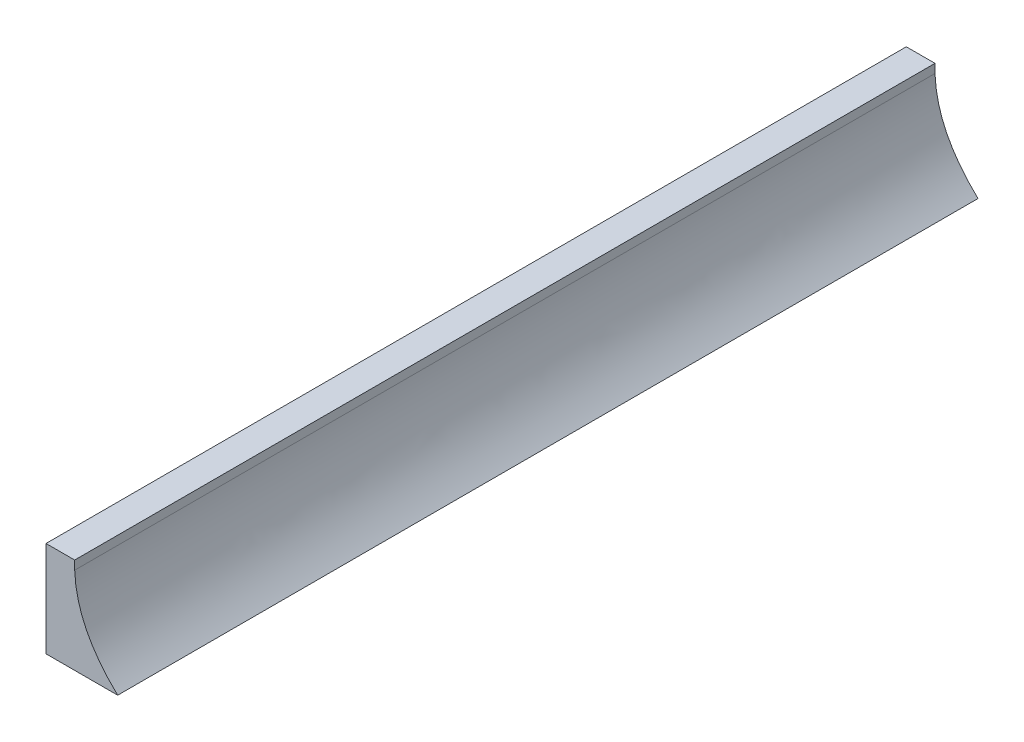
ISO-10303-21;
HEADER;
FILE_DESCRIPTION(('STEP AP214'),'2;1');
FILE_NAME('part.step','',(''),(''),'','','');
FILE_SCHEMA(('AUTOMOTIVE_DESIGN { 1 0 10303 214 1 1 1 1 }'));
ENDSEC;
DATA;
#1=APPLICATION_CONTEXT('core data for automotive mechanical design processes');
#2=APPLICATION_PROTOCOL_DEFINITION('international standard','automotive_design',2000,#1);
#3=PRODUCT_CONTEXT('',#1,'mechanical');
#4=PRODUCT('Part','Part','',(#3));
#5=PRODUCT_RELATED_PRODUCT_CATEGORY('part','',(#4));
#6=PRODUCT_DEFINITION_FORMATION('','',#4);
#7=PRODUCT_DEFINITION_CONTEXT('part definition',#1,'design');
#8=PRODUCT_DEFINITION('design','',#6,#7);
#9=PRODUCT_DEFINITION_SHAPE('','',#8);
#10=(LENGTH_UNIT() NAMED_UNIT(*) SI_UNIT(.MILLI.,.METRE.));
#11=(NAMED_UNIT(*) PLANE_ANGLE_UNIT() SI_UNIT($,.RADIAN.));
#12=(NAMED_UNIT(*) SI_UNIT($,.STERADIAN.) SOLID_ANGLE_UNIT());
#13=UNCERTAINTY_MEASURE_WITH_UNIT(LENGTH_MEASURE(1.E-05),#10,'distance_accuracy_value','');
#14=(GEOMETRIC_REPRESENTATION_CONTEXT(3) GLOBAL_UNCERTAINTY_ASSIGNED_CONTEXT((#13)) GLOBAL_UNIT_ASSIGNED_CONTEXT((#10,
#11,#12)) REPRESENTATION_CONTEXT('',''));
#15=CARTESIAN_POINT('',(0.,0.,0.));
#16=DIRECTION('',(0.,0.,1.));
#17=DIRECTION('',(1.,0.,0.));
#18=AXIS2_PLACEMENT_3D('',#15,#16,#17);
#19=CARTESIAN_POINT('',(0.,0.,180.));
#20=DIRECTION('',(0.,1.,0.));
#21=DIRECTION('',(0.,0.,1.));
#22=AXIS2_PLACEMENT_3D('',#19,#20,#21);
#23=PLANE('',#22);
#24=DIRECTION('',(0.,0.,1.));
#25=VECTOR('',#24,1.);
#26=CARTESIAN_POINT('',(0.,0.,110.));
#27=LINE('',#26,#25);
#28=CARTESIAN_POINT('',(0.,0.,110.));
#29=VERTEX_POINT('',#28);
#30=CARTESIAN_POINT('',(0.,0.,140.));
#31=VERTEX_POINT('',#30);
#32=EDGE_CURVE('E143',#29,#31,#27,.T.);
#33=ORIENTED_EDGE('',*,*,#32,.F.);
#34=DIRECTION('',(-1.,0.,0.));
#35=VECTOR('',#34,1.);
#36=CARTESIAN_POINT('',(0.,0.,110.));
#37=LINE('',#36,#35);
#38=CARTESIAN_POINT('',(-6.,0.,110.));
#39=VERTEX_POINT('',#38);
#40=EDGE_CURVE('E129',#29,#39,#37,.T.);
#41=ORIENTED_EDGE('',*,*,#40,.T.);
#42=DIRECTION('',(0.,0.,-1.));
#43=VECTOR('',#42,1.);
#44=CARTESIAN_POINT('',(-6.,0.,180.));
#45=LINE('',#44,#43);
#46=CARTESIAN_POINT('',(-6.,0.,70.));
#47=VERTEX_POINT('',#46);
#48=EDGE_CURVE('E55',#39,#47,#45,.T.);
#49=ORIENTED_EDGE('',*,*,#48,.T.);
#50=DIRECTION('',(-1.,0.,0.));
#51=VECTOR('',#50,1.);
#52=CARTESIAN_POINT('',(0.,0.,70.));
#53=LINE('',#52,#51);
#54=CARTESIAN_POINT('',(0.,0.,70.));
#55=VERTEX_POINT('',#54);
#56=EDGE_CURVE('E189',#55,#47,#53,.T.);
#57=ORIENTED_EDGE('',*,*,#56,.F.);
#58=DIRECTION('',(0.,0.,1.));
#59=VECTOR('',#58,1.);
#60=CARTESIAN_POINT('',(0.,0.,40.));
#61=LINE('',#60,#59);
#62=CARTESIAN_POINT('',(0.,0.,40.));
#63=VERTEX_POINT('',#62);
#64=EDGE_CURVE('E167',#63,#55,#61,.T.);
#65=ORIENTED_EDGE('',*,*,#64,.F.);
#66=DIRECTION('',(-1.,0.,0.));
#67=VECTOR('',#66,1.);
#68=CARTESIAN_POINT('',(0.,0.,40.));
#69=LINE('',#68,#67);
#70=CARTESIAN_POINT('',(-6.,0.,40.));
#71=VERTEX_POINT('',#70);
#72=EDGE_CURVE('E177',#63,#71,#69,.T.);
#73=ORIENTED_EDGE('',*,*,#72,.T.);
#74=CARTESIAN_POINT('',(-6.,0.,0.));
#75=VERTEX_POINT('',#74);
#76=EDGE_CURVE('E354',#71,#75,#45,.T.);
#77=ORIENTED_EDGE('',*,*,#76,.T.);
#78=DIRECTION('',(1.,0.,0.));
#79=VECTOR('',#78,1.);
#80=CARTESIAN_POINT('',(0.,0.,0.));
#81=LINE('',#80,#79);
#82=CARTESIAN_POINT('',(9.,0.,0.));
#83=VERTEX_POINT('',#82);
#84=EDGE_CURVE('E186',#75,#83,#81,.T.);
#85=ORIENTED_EDGE('',*,*,#84,.T.);
#86=DIRECTION('',(0.,0.,-1.));
#87=VECTOR('',#86,1.);
#88=CARTESIAN_POINT('',(9.,0.,180.));
#89=LINE('',#88,#87);
#90=CARTESIAN_POINT('',(9.,0.,180.));
#91=VERTEX_POINT('',#90);
#92=EDGE_CURVE('E11',#91,#83,#89,.T.);
#93=ORIENTED_EDGE('',*,*,#92,.F.);
#94=DIRECTION('',(1.,0.,0.));
#95=VECTOR('',#94,1.);
#96=CARTESIAN_POINT('',(0.,0.,180.));
#97=LINE('',#96,#95);
#98=CARTESIAN_POINT('',(-6.,0.,180.));
#99=VERTEX_POINT('',#98);
#100=EDGE_CURVE('E193',#99,#91,#97,.T.);
#101=ORIENTED_EDGE('',*,*,#100,.F.);
#102=CARTESIAN_POINT('',(-6.,0.,140.));
#103=VERTEX_POINT('',#102);
#104=EDGE_CURVE('E353',#99,#103,#45,.T.);
#105=ORIENTED_EDGE('',*,*,#104,.T.);
#106=DIRECTION('',(-1.,0.,0.));
#107=VECTOR('',#106,1.);
#108=CARTESIAN_POINT('',(0.,0.,140.));
#109=LINE('',#108,#107);
#110=EDGE_CURVE('E47',#31,#103,#109,.T.);
#111=ORIENTED_EDGE('',*,*,#110,.F.);
#112=EDGE_LOOP('',(#33,#41,#49,#57,#65,#73,#77,#85,#93,#101,#105,#111));
#113=FACE_BOUND('',#112,.T.);
#114=ADVANCED_FACE('F33',(#113),#23,.F.);
#115=CARTESIAN_POINT('',(9.,0.,180.));
#116=CARTESIAN_POINT('',(0.375552148497563,8.11125236347616,180.));
#117=CARTESIAN_POINT('',(0.,18.1549227587006,180.));
#118=B_SPLINE_CURVE_WITH_KNOTS('',2,(#115,#116,#117),.UNSPECIFIED.,.F.,.F.,(3,3),
(0.0834560330001403,1.),.UNSPECIFIED.);
#119=DIRECTION('',(0.,0.,-1.));
#120=VECTOR('',#119,1.);
#121=SURFACE_OF_LINEAR_EXTRUSION('',#118,#120);
#122=CARTESIAN_POINT('',(9.,0.,0.));
#123=CARTESIAN_POINT('',(0.375552148497563,8.11125236347616,0.));
#124=CARTESIAN_POINT('',(0.,18.1549227587006,0.));
#125=B_SPLINE_CURVE_WITH_KNOTS('',2,(#122,#123,#124),.UNSPECIFIED.,.F.,.F.,(3,3),
(0.0834560330001403,1.),.UNSPECIFIED.);
#126=CARTESIAN_POINT('',(0.,18.1549227587006,0.));
#127=VERTEX_POINT('',#126);
#128=EDGE_CURVE('E375',#83,#127,#125,.T.);
#129=ORIENTED_EDGE('',*,*,#128,.T.);
#130=DIRECTION('',(0.,0.,-1.));
#131=VECTOR('',#130,1.);
#132=CARTESIAN_POINT('',(0.,18.1549227587006,180.));
#133=LINE('',#132,#131);
#134=CARTESIAN_POINT('',(0.,18.1549227587006,180.));
#135=VERTEX_POINT('',#134);
#136=EDGE_CURVE('E40',#135,#127,#133,.T.);
#137=ORIENTED_EDGE('',*,*,#136,.F.);
#138=EDGE_CURVE('E195',#91,#135,#118,.T.);
#139=ORIENTED_EDGE('',*,*,#138,.F.);
#140=ORIENTED_EDGE('',*,*,#92,.T.);
#141=EDGE_LOOP('',(#129,#137,#139,#140));
#142=FACE_BOUND('',#141,.T.);
#143=ADVANCED_FACE('F206',(#142),#121,.F.);
#144=CARTESIAN_POINT('',(0.,18.1549227587006,180.));
#145=DIRECTION('',(-1.,0.,0.));
#146=DIRECTION('',(0.,0.,1.));
#147=AXIS2_PLACEMENT_3D('',#144,#145,#146);
#148=PLANE('',#147);
#149=DIRECTION('',(0.,1.,0.));
#150=VECTOR('',#149,1.);
#151=CARTESIAN_POINT('',(0.,18.1549227587006,0.));
#152=LINE('',#151,#150);
#153=CARTESIAN_POINT('',(0.,20.,0.));
#154=VERTEX_POINT('',#153);
#155=EDGE_CURVE('E370',#127,#154,#152,.T.);
#156=ORIENTED_EDGE('',*,*,#155,.T.);
#157=DIRECTION('',(0.,0.,-1.));
#158=VECTOR('',#157,1.);
#159=CARTESIAN_POINT('',(0.,20.,180.));
#160=LINE('',#159,#158);
#161=CARTESIAN_POINT('',(0.,20.,180.));
#162=VERTEX_POINT('',#161);
#163=EDGE_CURVE('E363',#162,#154,#160,.T.);
#164=ORIENTED_EDGE('',*,*,#163,.F.);
#165=DIRECTION('',(0.,1.,0.));
#166=VECTOR('',#165,1.);
#167=CARTESIAN_POINT('',(0.,18.1549227587006,180.));
#168=LINE('',#167,#166);
#169=EDGE_CURVE('E201',#135,#162,#168,.T.);
#170=ORIENTED_EDGE('',*,*,#169,.F.);
#171=ORIENTED_EDGE('',*,*,#136,.T.);
#172=EDGE_LOOP('',(#156,#164,#170,#171));
#173=FACE_BOUND('',#172,.T.);
#174=ADVANCED_FACE('F209',(#173),#148,.F.);
#175=CARTESIAN_POINT('',(0.,20.,180.));
#176=DIRECTION('',(0.,-1.,0.));
#177=DIRECTION('',(0.,0.,-1.));
#178=AXIS2_PLACEMENT_3D('',#175,#176,#177);
#179=PLANE('',#178);
#180=DIRECTION('',(-1.,0.,0.));
#181=VECTOR('',#180,1.);
#182=CARTESIAN_POINT('',(0.,20.,0.));
#183=LINE('',#182,#181);
#184=CARTESIAN_POINT('',(-6.,20.,0.));
#185=VERTEX_POINT('',#184);
#186=EDGE_CURVE('E377',#154,#185,#183,.T.);
#187=ORIENTED_EDGE('',*,*,#186,.T.);
#188=DIRECTION('',(0.,0.,-1.));
#189=VECTOR('',#188,1.);
#190=CARTESIAN_POINT('',(-6.,20.,180.));
#191=LINE('',#190,#189);
#192=CARTESIAN_POINT('',(-6.,20.,180.));
#193=VERTEX_POINT('',#192);
#194=EDGE_CURVE('E356',#193,#185,#191,.T.);
#195=ORIENTED_EDGE('',*,*,#194,.F.);
#196=DIRECTION('',(-1.,0.,0.));
#197=VECTOR('',#196,1.);
#198=CARTESIAN_POINT('',(0.,20.,180.));
#199=LINE('',#198,#197);
#200=EDGE_CURVE('E387',#162,#193,#199,.T.);
#201=ORIENTED_EDGE('',*,*,#200,.F.);
#202=ORIENTED_EDGE('',*,*,#163,.T.);
#203=EDGE_LOOP('',(#187,#195,#201,#202));
#204=FACE_BOUND('',#203,.T.);
#205=ADVANCED_FACE('F213',(#204),#179,.F.);
#206=CARTESIAN_POINT('',(-6.,0.,180.));
#207=DIRECTION('',(1.,0.,0.));
#208=DIRECTION('',(0.,1.,0.));
#209=AXIS2_PLACEMENT_3D('',#206,#207,#208);
#210=PLANE('',#209);
#211=ORIENTED_EDGE('',*,*,#48,.F.);
#212=DIRECTION('',(0.,-1.,0.));
#213=VECTOR('',#212,1.);
#214=CARTESIAN_POINT('',(-6.,0.,110.));
#215=LINE('',#214,#213);
#216=CARTESIAN_POINT('',(-6.,6.,110.));
#217=VERTEX_POINT('',#216);
#218=EDGE_CURVE('E135',#217,#39,#215,.T.);
#219=ORIENTED_EDGE('',*,*,#218,.F.);
#220=DIRECTION('',(0.,0.,-1.));
#221=VECTOR('',#220,1.);
#222=CARTESIAN_POINT('',(-6.,6.,110.));
#223=LINE('',#222,#221);
#224=CARTESIAN_POINT('',(-6.,6.,140.));
#225=VERTEX_POINT('',#224);
#226=EDGE_CURVE('E145',#225,#217,#223,.T.);
#227=ORIENTED_EDGE('',*,*,#226,.F.);
#228=DIRECTION('',(0.,1.,0.));
#229=VECTOR('',#228,1.);
#230=CARTESIAN_POINT('',(-6.,0.,140.));
#231=LINE('',#230,#229);
#232=EDGE_CURVE('E154',#103,#225,#231,.T.);
#233=ORIENTED_EDGE('',*,*,#232,.F.);
#234=ORIENTED_EDGE('',*,*,#104,.F.);
#235=DIRECTION('',(0.,-1.,0.));
#236=VECTOR('',#235,1.);
#237=CARTESIAN_POINT('',(-6.,0.,180.));
#238=LINE('',#237,#236);
#239=EDGE_CURVE('E357',#193,#99,#238,.T.);
#240=ORIENTED_EDGE('',*,*,#239,.F.);
#241=ORIENTED_EDGE('',*,*,#194,.T.);
#242=DIRECTION('',(0.,-1.,0.));
#243=VECTOR('',#242,1.);
#244=CARTESIAN_POINT('',(-6.,0.,0.));
#245=LINE('',#244,#243);
#246=EDGE_CURVE('E196',#185,#75,#245,.T.);
#247=ORIENTED_EDGE('',*,*,#246,.T.);
#248=ORIENTED_EDGE('',*,*,#76,.F.);
#249=DIRECTION('',(0.,-1.,0.));
#250=VECTOR('',#249,1.);
#251=CARTESIAN_POINT('',(-6.,0.,40.));
#252=LINE('',#251,#250);
#253=CARTESIAN_POINT('',(-6.,6.00000000000002,40.));
#254=VERTEX_POINT('',#253);
#255=EDGE_CURVE('E160',#254,#71,#252,.T.);
#256=ORIENTED_EDGE('',*,*,#255,.F.);
#257=DIRECTION('',(0.,0.,-1.));
#258=VECTOR('',#257,1.);
#259=CARTESIAN_POINT('',(-6.,6.00000000000002,40.));
#260=LINE('',#259,#258);
#261=CARTESIAN_POINT('',(-6.,6.00000000000002,70.));
#262=VERTEX_POINT('',#261);
#263=EDGE_CURVE('E168',#262,#254,#260,.T.);
#264=ORIENTED_EDGE('',*,*,#263,.F.);
#265=DIRECTION('',(0.,1.,0.));
#266=VECTOR('',#265,1.);
#267=CARTESIAN_POINT('',(-6.,0.,70.));
#268=LINE('',#267,#266);
#269=EDGE_CURVE('E179',#47,#262,#268,.T.);
#270=ORIENTED_EDGE('',*,*,#269,.F.);
#271=EDGE_LOOP('',(#211,#219,#227,#233,#234,#240,#241,#247,#248,#256,#264,#270));
#272=FACE_BOUND('',#271,.T.);
#273=ADVANCED_FACE('F217',(#272),#210,.F.);
#274=CARTESIAN_POINT('',(2.43777607424878,8.59435687141322,180.));
#275=DIRECTION('',(0.,0.,-1.));
#276=DIRECTION('',(-1.,0.,0.));
#277=AXIS2_PLACEMENT_3D('',#274,#275,#276);
#278=PLANE('',#277);
#279=ORIENTED_EDGE('',*,*,#100,.T.);
#280=ORIENTED_EDGE('',*,*,#138,.T.);
#281=ORIENTED_EDGE('',*,*,#169,.T.);
#282=ORIENTED_EDGE('',*,*,#200,.T.);
#283=ORIENTED_EDGE('',*,*,#239,.T.);
#284=EDGE_LOOP('',(#279,#280,#281,#282,#283));
#285=FACE_BOUND('',#284,.T.);
#286=ADVANCED_FACE('F221',(#285),#278,.F.);
#287=CARTESIAN_POINT('',(2.43777607424878,8.59435687141322,0.));
#288=DIRECTION('',(0.,0.,-1.));
#289=DIRECTION('',(-1.,0.,0.));
#290=AXIS2_PLACEMENT_3D('',#287,#288,#289);
#291=PLANE('',#290);
#292=ORIENTED_EDGE('',*,*,#84,.F.);
#293=ORIENTED_EDGE('',*,*,#246,.F.);
#294=ORIENTED_EDGE('',*,*,#186,.F.);
#295=ORIENTED_EDGE('',*,*,#155,.F.);
#296=ORIENTED_EDGE('',*,*,#128,.F.);
#297=EDGE_LOOP('',(#292,#293,#294,#295,#296));
#298=FACE_BOUND('',#297,.T.);
#299=ADVANCED_FACE('F223',(#298),#291,.T.);
#300=CARTESIAN_POINT('',(0.,0.,40.));
#301=DIRECTION('',(0.,0.,-1.));
#302=DIRECTION('',(-1.,0.,0.));
#303=AXIS2_PLACEMENT_3D('',#300,#301,#302);
#304=PLANE('',#303);
#305=ORIENTED_EDGE('',*,*,#255,.T.);
#306=ORIENTED_EDGE('',*,*,#72,.F.);
#307=DIRECTION('',(0.,-1.,0.));
#308=VECTOR('',#307,1.);
#309=CARTESIAN_POINT('',(0.,0.,40.));
#310=LINE('',#309,#308);
#311=CARTESIAN_POINT('',(0.,6.00000000000002,40.));
#312=VERTEX_POINT('',#311);
#313=EDGE_CURVE('E164',#312,#63,#310,.T.);
#314=ORIENTED_EDGE('',*,*,#313,.F.);
#315=DIRECTION('',(-1.,0.,0.));
#316=VECTOR('',#315,1.);
#317=CARTESIAN_POINT('',(0.,6.00000000000002,40.));
#318=LINE('',#317,#316);
#319=EDGE_CURVE('E184',#312,#254,#318,.T.);
#320=ORIENTED_EDGE('',*,*,#319,.T.);
#321=EDGE_LOOP('',(#305,#306,#314,#320));
#322=FACE_BOUND('',#321,.T.);
#323=ADVANCED_FACE('F226',(#322),#304,.F.);
#324=CARTESIAN_POINT('',(0.,6.00000000000002,40.));
#325=DIRECTION('',(0.,1.,0.));
#326=DIRECTION('',(0.,0.,1.));
#327=AXIS2_PLACEMENT_3D('',#324,#325,#326);
#328=PLANE('',#327);
#329=ORIENTED_EDGE('',*,*,#263,.T.);
#330=ORIENTED_EDGE('',*,*,#319,.F.);
#331=DIRECTION('',(0.,0.,-1.));
#332=VECTOR('',#331,1.);
#333=CARTESIAN_POINT('',(0.,6.00000000000002,40.));
#334=LINE('',#333,#332);
#335=CARTESIAN_POINT('',(0.,6.00000000000002,70.));
#336=VERTEX_POINT('',#335);
#337=EDGE_CURVE('E174',#336,#312,#334,.T.);
#338=ORIENTED_EDGE('',*,*,#337,.F.);
#339=DIRECTION('',(-1.,0.,0.));
#340=VECTOR('',#339,1.);
#341=CARTESIAN_POINT('',(0.,6.00000000000002,70.));
#342=LINE('',#341,#340);
#343=EDGE_CURVE('E187',#336,#262,#342,.T.);
#344=ORIENTED_EDGE('',*,*,#343,.T.);
#345=EDGE_LOOP('',(#329,#330,#338,#344));
#346=FACE_BOUND('',#345,.T.);
#347=ADVANCED_FACE('F233',(#346),#328,.F.);
#348=CARTESIAN_POINT('',(0.,0.,70.));
#349=DIRECTION('',(0.,0.,1.));
#350=DIRECTION('',(0.,-1.,0.));
#351=AXIS2_PLACEMENT_3D('',#348,#349,#350);
#352=PLANE('',#351);
#353=ORIENTED_EDGE('',*,*,#269,.T.);
#354=ORIENTED_EDGE('',*,*,#343,.F.);
#355=DIRECTION('',(0.,1.,0.));
#356=VECTOR('',#355,1.);
#357=CARTESIAN_POINT('',(0.,0.,70.));
#358=LINE('',#357,#356);
#359=EDGE_CURVE('E171',#55,#336,#358,.T.);
#360=ORIENTED_EDGE('',*,*,#359,.F.);
#361=ORIENTED_EDGE('',*,*,#56,.T.);
#362=EDGE_LOOP('',(#353,#354,#360,#361));
#363=FACE_BOUND('',#362,.T.);
#364=ADVANCED_FACE('F235',(#363),#352,.F.);
#365=CARTESIAN_POINT('',(0.,0.,0.));
#366=DIRECTION('',(1.,0.,0.));
#367=DIRECTION('',(0.,1.,0.));
#368=AXIS2_PLACEMENT_3D('',#365,#366,#367);
#369=PLANE('',#368);
#370=ORIENTED_EDGE('',*,*,#313,.T.);
#371=ORIENTED_EDGE('',*,*,#64,.T.);
#372=ORIENTED_EDGE('',*,*,#359,.T.);
#373=ORIENTED_EDGE('',*,*,#337,.T.);
#374=EDGE_LOOP('',(#370,#371,#372,#373));
#375=FACE_BOUND('',#374,.T.);
#376=ADVANCED_FACE('F238',(#375),#369,.F.);
#377=CARTESIAN_POINT('',(0.,0.,110.));
#378=DIRECTION('',(0.,0.,-1.));
#379=DIRECTION('',(-1.,0.,0.));
#380=AXIS2_PLACEMENT_3D('',#377,#378,#379);
#381=PLANE('',#380);
#382=ORIENTED_EDGE('',*,*,#218,.T.);
#383=ORIENTED_EDGE('',*,*,#40,.F.);
#384=DIRECTION('',(0.,-1.,0.));
#385=VECTOR('',#384,1.);
#386=CARTESIAN_POINT('',(0.,0.,110.));
#387=LINE('',#386,#385);
#388=CARTESIAN_POINT('',(0.,6.,110.));
#389=VERTEX_POINT('',#388);
#390=EDGE_CURVE('E132',#389,#29,#387,.T.);
#391=ORIENTED_EDGE('',*,*,#390,.F.);
#392=DIRECTION('',(-1.,0.,0.));
#393=VECTOR('',#392,1.);
#394=CARTESIAN_POINT('',(0.,6.,110.));
#395=LINE('',#394,#393);
#396=EDGE_CURVE('E158',#389,#217,#395,.T.);
#397=ORIENTED_EDGE('',*,*,#396,.T.);
#398=EDGE_LOOP('',(#382,#383,#391,#397));
#399=FACE_BOUND('',#398,.T.);
#400=ADVANCED_FACE('F131',(#399),#381,.F.);
#401=CARTESIAN_POINT('',(0.,6.,110.));
#402=DIRECTION('',(0.,1.,0.));
#403=DIRECTION('',(-1.,0.,0.));
#404=AXIS2_PLACEMENT_3D('',#401,#402,#403);
#405=PLANE('',#404);
#406=ORIENTED_EDGE('',*,*,#226,.T.);
#407=ORIENTED_EDGE('',*,*,#396,.F.);
#408=DIRECTION('',(0.,0.,-1.));
#409=VECTOR('',#408,1.);
#410=CARTESIAN_POINT('',(0.,6.,110.));
#411=LINE('',#410,#409);
#412=CARTESIAN_POINT('',(0.,6.,140.));
#413=VERTEX_POINT('',#412);
#414=EDGE_CURVE('E137',#413,#389,#411,.T.);
#415=ORIENTED_EDGE('',*,*,#414,.F.);
#416=DIRECTION('',(-1.,0.,0.));
#417=VECTOR('',#416,1.);
#418=CARTESIAN_POINT('',(0.,6.,140.));
#419=LINE('',#418,#417);
#420=EDGE_CURVE('E161',#413,#225,#419,.T.);
#421=ORIENTED_EDGE('',*,*,#420,.T.);
#422=EDGE_LOOP('',(#406,#407,#415,#421));
#423=FACE_BOUND('',#422,.T.);
#424=ADVANCED_FACE('F248',(#423),#405,.F.);
#425=CARTESIAN_POINT('',(0.,0.,140.));
#426=DIRECTION('',(0.,0.,1.));
#427=DIRECTION('',(1.,0.,0.));
#428=AXIS2_PLACEMENT_3D('',#425,#426,#427);
#429=PLANE('',#428);
#430=ORIENTED_EDGE('',*,*,#232,.T.);
#431=ORIENTED_EDGE('',*,*,#420,.F.);
#432=DIRECTION('',(0.,1.,0.));
#433=VECTOR('',#432,1.);
#434=CARTESIAN_POINT('',(0.,0.,140.));
#435=LINE('',#434,#433);
#436=EDGE_CURVE('E148',#31,#413,#435,.T.);
#437=ORIENTED_EDGE('',*,*,#436,.F.);
#438=ORIENTED_EDGE('',*,*,#110,.T.);
#439=EDGE_LOOP('',(#430,#431,#437,#438));
#440=FACE_BOUND('',#439,.T.);
#441=ADVANCED_FACE('F249',(#440),#429,.F.);
#442=CARTESIAN_POINT('',(0.,0.,0.));
#443=DIRECTION('',(1.,0.,0.));
#444=DIRECTION('',(0.,1.,0.));
#445=AXIS2_PLACEMENT_3D('',#442,#443,#444);
#446=PLANE('',#445);
#447=ORIENTED_EDGE('',*,*,#390,.T.);
#448=ORIENTED_EDGE('',*,*,#32,.T.);
#449=ORIENTED_EDGE('',*,*,#436,.T.);
#450=ORIENTED_EDGE('',*,*,#414,.T.);
#451=EDGE_LOOP('',(#447,#448,#449,#450));
#452=FACE_BOUND('',#451,.T.);
#453=ADVANCED_FACE('F141',(#452),#446,.F.);
#454=CLOSED_SHELL('',(#114,#143,#174,#205,#273,#286,#299,#323,#347,#364,#376,#400,#424,#441,#453));
#455=MANIFOLD_SOLID_BREP('B2',#454);
#456=ADVANCED_BREP_SHAPE_REPRESENTATION('',(#18,#455),#14);
#457=SHAPE_DEFINITION_REPRESENTATION(#9,#456);
ENDSEC;
END-ISO-10303-21;
